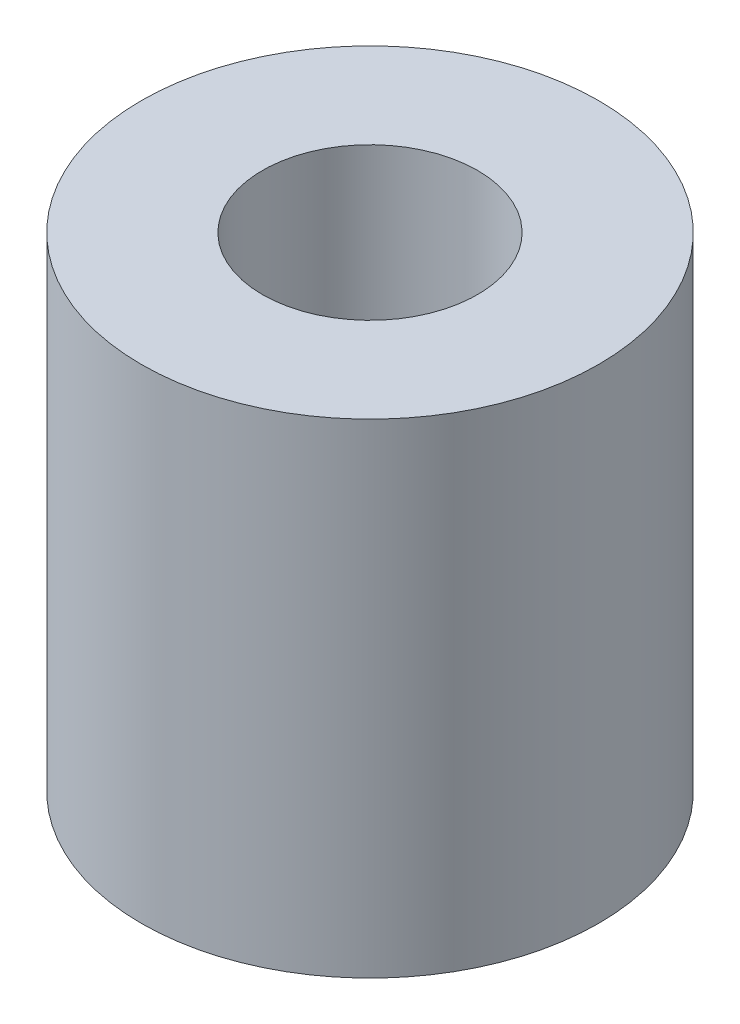
ISO-10303-21;
HEADER;
FILE_DESCRIPTION(('STEP AP214'),'2;1');
FILE_NAME('part.step','',(''),(''),'','','');
FILE_SCHEMA(('AUTOMOTIVE_DESIGN { 1 0 10303 214 1 1 1 1 }'));
ENDSEC;
DATA;
#1=APPLICATION_CONTEXT('core data for automotive mechanical design processes');
#2=APPLICATION_PROTOCOL_DEFINITION('international standard','automotive_design',2000,#1);
#3=PRODUCT_CONTEXT('',#1,'mechanical');
#4=PRODUCT('Part','Part','',(#3));
#5=PRODUCT_RELATED_PRODUCT_CATEGORY('part','',(#4));
#6=PRODUCT_DEFINITION_FORMATION('','',#4);
#7=PRODUCT_DEFINITION_CONTEXT('part definition',#1,'design');
#8=PRODUCT_DEFINITION('design','',#6,#7);
#9=PRODUCT_DEFINITION_SHAPE('','',#8);
#10=(LENGTH_UNIT() NAMED_UNIT(*) SI_UNIT(.MILLI.,.METRE.));
#11=(NAMED_UNIT(*) PLANE_ANGLE_UNIT() SI_UNIT($,.RADIAN.));
#12=(NAMED_UNIT(*) SI_UNIT($,.STERADIAN.) SOLID_ANGLE_UNIT());
#13=UNCERTAINTY_MEASURE_WITH_UNIT(LENGTH_MEASURE(1.E-05),#10,'distance_accuracy_value','');
#14=(GEOMETRIC_REPRESENTATION_CONTEXT(3) GLOBAL_UNCERTAINTY_ASSIGNED_CONTEXT((#13)) GLOBAL_UNIT_ASSIGNED_CONTEXT((#10,
#11,#12)) REPRESENTATION_CONTEXT('',''));
#15=CARTESIAN_POINT('',(0.,0.,0.));
#16=DIRECTION('',(0.,0.,1.));
#17=DIRECTION('',(1.,0.,0.));
#18=AXIS2_PLACEMENT_3D('',#15,#16,#17);
#19=CARTESIAN_POINT('',(0.,11.43,0.));
#20=DIRECTION('',(0.,1.,0.));
#21=DIRECTION('',(0.,0.,1.));
#22=AXIS2_PLACEMENT_3D('',#19,#20,#21);
#23=PLANE('',#22);
#24=CARTESIAN_POINT('',(0.,11.43,0.));
#25=DIRECTION('',(0.,1.,0.));
#26=DIRECTION('',(0.,0.,1.));
#27=AXIS2_PLACEMENT_3D('',#24,#25,#26);
#28=CIRCLE('',#27,5.3975);
#29=CARTESIAN_POINT('',(0.,11.43,5.3975));
#30=VERTEX_POINT('',#29);
#31=EDGE_CURVE('E10',#30,#30,#28,.T.);
#32=ORIENTED_EDGE('',*,*,#31,.T.);
#33=EDGE_LOOP('',(#32));
#34=FACE_BOUND('',#33,.T.);
#35=CARTESIAN_POINT('',(0.,11.43,0.));
#36=DIRECTION('',(0.,1.,0.));
#37=DIRECTION('',(0.,0.,1.));
#38=AXIS2_PLACEMENT_3D('',#35,#36,#37);
#39=CIRCLE('',#38,2.54);
#40=CARTESIAN_POINT('',(0.,11.43,2.54));
#41=VERTEX_POINT('',#40);
#42=EDGE_CURVE('E56',#41,#41,#39,.T.);
#43=ORIENTED_EDGE('',*,*,#42,.F.);
#44=EDGE_LOOP('',(#43));
#45=FACE_BOUND('',#44,.T.);
#46=ADVANCED_FACE('F43',(#34,#45),#23,.T.);
#47=CARTESIAN_POINT('',(0.,0.,0.));
#48=DIRECTION('',(0.,1.,0.));
#49=DIRECTION('',(0.,0.,1.));
#50=AXIS2_PLACEMENT_3D('',#47,#48,#49);
#51=PLANE('',#50);
#52=CARTESIAN_POINT('',(0.,0.,0.));
#53=DIRECTION('',(0.,1.,0.));
#54=DIRECTION('',(0.,0.,1.));
#55=AXIS2_PLACEMENT_3D('',#52,#53,#54);
#56=CIRCLE('',#55,5.3975);
#57=CARTESIAN_POINT('',(0.,0.,5.3975));
#58=VERTEX_POINT('',#57);
#59=EDGE_CURVE('E47',#58,#58,#56,.T.);
#60=ORIENTED_EDGE('',*,*,#59,.F.);
#61=EDGE_LOOP('',(#60));
#62=FACE_BOUND('',#61,.T.);
#63=CARTESIAN_POINT('',(0.,0.,0.));
#64=DIRECTION('',(0.,1.,0.));
#65=DIRECTION('',(0.,0.,1.));
#66=AXIS2_PLACEMENT_3D('',#63,#64,#65);
#67=CIRCLE('',#66,2.54);
#68=CARTESIAN_POINT('',(0.,0.,2.54));
#69=VERTEX_POINT('',#68);
#70=EDGE_CURVE('E58',#69,#69,#67,.T.);
#71=ORIENTED_EDGE('',*,*,#70,.T.);
#72=EDGE_LOOP('',(#71));
#73=FACE_BOUND('',#72,.T.);
#74=ADVANCED_FACE('F70',(#62,#73),#51,.F.);
#75=CARTESIAN_POINT('',(0.,11.43,0.));
#76=DIRECTION('',(0.,-1.,0.));
#77=DIRECTION('',(0.,0.,-1.));
#78=AXIS2_PLACEMENT_3D('',#75,#76,#77);
#79=CYLINDRICAL_SURFACE('',#78,5.3975);
#80=ORIENTED_EDGE('',*,*,#31,.F.);
#81=EDGE_LOOP('',(#80));
#82=FACE_BOUND('',#81,.T.);
#83=ORIENTED_EDGE('',*,*,#59,.T.);
#84=EDGE_LOOP('',(#83));
#85=FACE_BOUND('',#84,.T.);
#86=ADVANCED_FACE('F45',(#82,#85),#79,.T.);
#87=CARTESIAN_POINT('',(0.,11.43,0.));
#88=DIRECTION('',(0.,-1.,0.));
#89=DIRECTION('',(0.,0.,-1.));
#90=AXIS2_PLACEMENT_3D('',#87,#88,#89);
#91=CYLINDRICAL_SURFACE('',#90,2.54);
#92=ORIENTED_EDGE('',*,*,#42,.T.);
#93=EDGE_LOOP('',(#92));
#94=FACE_BOUND('',#93,.T.);
#95=ORIENTED_EDGE('',*,*,#70,.F.);
#96=EDGE_LOOP('',(#95));
#97=FACE_BOUND('',#96,.T.);
#98=ADVANCED_FACE('F66',(#94,#97),#91,.F.);
#99=CLOSED_SHELL('',(#46,#74,#86,#98));
#100=MANIFOLD_SOLID_BREP('B2',#99);
#101=ADVANCED_BREP_SHAPE_REPRESENTATION('',(#18,#100),#14);
#102=SHAPE_DEFINITION_REPRESENTATION(#9,#101);
ENDSEC;
END-ISO-10303-21;
